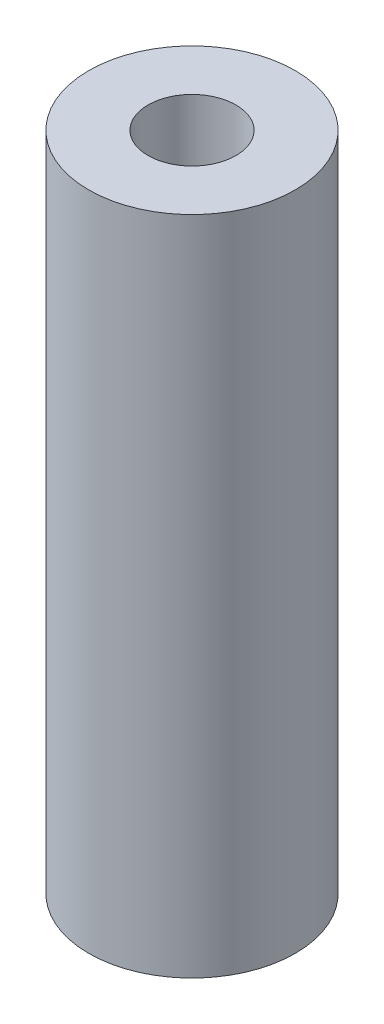
ISO-10303-21;
HEADER;
FILE_DESCRIPTION(('STEP AP214'),'2;1');
FILE_NAME('part.step','',(''),(''),'','','');
FILE_SCHEMA(('AUTOMOTIVE_DESIGN { 1 0 10303 214 1 1 1 1 }'));
ENDSEC;
DATA;
#1=APPLICATION_CONTEXT('core data for automotive mechanical design processes');
#2=APPLICATION_PROTOCOL_DEFINITION('international standard','automotive_design',2000,#1);
#3=PRODUCT_CONTEXT('',#1,'mechanical');
#4=PRODUCT('Part','Part','',(#3));
#5=PRODUCT_RELATED_PRODUCT_CATEGORY('part','',(#4));
#6=PRODUCT_DEFINITION_FORMATION('','',#4);
#7=PRODUCT_DEFINITION_CONTEXT('part definition',#1,'design');
#8=PRODUCT_DEFINITION('design','',#6,#7);
#9=PRODUCT_DEFINITION_SHAPE('','',#8);
#10=(LENGTH_UNIT() NAMED_UNIT(*) SI_UNIT(.MILLI.,.METRE.));
#11=(NAMED_UNIT(*) PLANE_ANGLE_UNIT() SI_UNIT($,.RADIAN.));
#12=(NAMED_UNIT(*) SI_UNIT($,.STERADIAN.) SOLID_ANGLE_UNIT());
#13=UNCERTAINTY_MEASURE_WITH_UNIT(LENGTH_MEASURE(1.E-05),#10,'distance_accuracy_value','');
#14=(GEOMETRIC_REPRESENTATION_CONTEXT(3) GLOBAL_UNCERTAINTY_ASSIGNED_CONTEXT((#13)) GLOBAL_UNIT_ASSIGNED_CONTEXT((#10,
#11,#12)) REPRESENTATION_CONTEXT('',''));
#15=CARTESIAN_POINT('',(0.,0.,0.));
#16=DIRECTION('',(0.,0.,1.));
#17=DIRECTION('',(1.,0.,0.));
#18=AXIS2_PLACEMENT_3D('',#15,#16,#17);
#19=CARTESIAN_POINT('',(0.,50.8,0.));
#20=DIRECTION('',(0.,1.,0.));
#21=DIRECTION('',(0.,0.,1.));
#22=AXIS2_PLACEMENT_3D('',#19,#20,#21);
#23=PLANE('',#22);
#24=CARTESIAN_POINT('',(0.,50.8,0.));
#25=DIRECTION('',(0.,1.,0.));
#26=DIRECTION('',(0.,0.,1.));
#27=AXIS2_PLACEMENT_3D('',#24,#25,#26);
#28=CIRCLE('',#27,7.9375);
#29=CARTESIAN_POINT('',(0.,50.8,7.9375));
#30=VERTEX_POINT('',#29);
#31=EDGE_CURVE('E10',#30,#30,#28,.T.);
#32=ORIENTED_EDGE('',*,*,#31,.T.);
#33=EDGE_LOOP('',(#32));
#34=FACE_BOUND('',#33,.T.);
#35=CARTESIAN_POINT('',(0.,50.8,0.));
#36=DIRECTION('',(0.,1.,0.));
#37=DIRECTION('',(0.,0.,1.));
#38=AXIS2_PLACEMENT_3D('',#35,#36,#37);
#39=CIRCLE('',#38,3.3734375);
#40=CARTESIAN_POINT('',(0.,50.8,3.3734375));
#41=VERTEX_POINT('',#40);
#42=EDGE_CURVE('E42',#41,#41,#39,.T.);
#43=ORIENTED_EDGE('',*,*,#42,.F.);
#44=EDGE_LOOP('',(#43));
#45=FACE_BOUND('',#44,.T.);
#46=ADVANCED_FACE('F31',(#34,#45),#23,.T.);
#47=CARTESIAN_POINT('',(0.,0.,0.));
#48=DIRECTION('',(0.,1.,0.));
#49=DIRECTION('',(0.,0.,1.));
#50=AXIS2_PLACEMENT_3D('',#47,#48,#49);
#51=PLANE('',#50);
#52=CARTESIAN_POINT('',(0.,0.,0.));
#53=DIRECTION('',(0.,1.,0.));
#54=DIRECTION('',(0.,0.,1.));
#55=AXIS2_PLACEMENT_3D('',#52,#53,#54);
#56=CIRCLE('',#55,7.9375);
#57=CARTESIAN_POINT('',(0.,0.,7.9375));
#58=VERTEX_POINT('',#57);
#59=EDGE_CURVE('E35',#58,#58,#56,.T.);
#60=ORIENTED_EDGE('',*,*,#59,.F.);
#61=EDGE_LOOP('',(#60));
#62=FACE_BOUND('',#61,.T.);
#63=CARTESIAN_POINT('',(0.,0.,0.));
#64=DIRECTION('',(0.,1.,0.));
#65=DIRECTION('',(0.,0.,1.));
#66=AXIS2_PLACEMENT_3D('',#63,#64,#65);
#67=CIRCLE('',#66,3.3734375);
#68=CARTESIAN_POINT('',(0.,0.,3.3734375));
#69=VERTEX_POINT('',#68);
#70=EDGE_CURVE('E44',#69,#69,#67,.T.);
#71=ORIENTED_EDGE('',*,*,#70,.T.);
#72=EDGE_LOOP('',(#71));
#73=FACE_BOUND('',#72,.T.);
#74=ADVANCED_FACE('F54',(#62,#73),#51,.F.);
#75=CARTESIAN_POINT('',(0.,50.8,0.));
#76=DIRECTION('',(0.,-1.,0.));
#77=DIRECTION('',(0.,0.,-1.));
#78=AXIS2_PLACEMENT_3D('',#75,#76,#77);
#79=CYLINDRICAL_SURFACE('',#78,7.9375);
#80=ORIENTED_EDGE('',*,*,#31,.F.);
#81=EDGE_LOOP('',(#80));
#82=FACE_BOUND('',#81,.T.);
#83=ORIENTED_EDGE('',*,*,#59,.T.);
#84=EDGE_LOOP('',(#83));
#85=FACE_BOUND('',#84,.T.);
#86=ADVANCED_FACE('F33',(#82,#85),#79,.T.);
#87=CARTESIAN_POINT('',(0.,50.8,0.));
#88=DIRECTION('',(0.,-1.,0.));
#89=DIRECTION('',(0.,0.,-1.));
#90=AXIS2_PLACEMENT_3D('',#87,#88,#89);
#91=CYLINDRICAL_SURFACE('',#90,3.3734375);
#92=ORIENTED_EDGE('',*,*,#42,.T.);
#93=EDGE_LOOP('',(#92));
#94=FACE_BOUND('',#93,.T.);
#95=ORIENTED_EDGE('',*,*,#70,.F.);
#96=EDGE_LOOP('',(#95));
#97=FACE_BOUND('',#96,.T.);
#98=ADVANCED_FACE('F50',(#94,#97),#91,.F.);
#99=CLOSED_SHELL('',(#46,#74,#86,#98));
#100=MANIFOLD_SOLID_BREP('B2',#99);
#101=ADVANCED_BREP_SHAPE_REPRESENTATION('',(#18,#100),#14);
#102=SHAPE_DEFINITION_REPRESENTATION(#9,#101);
ENDSEC;
END-ISO-10303-21;
